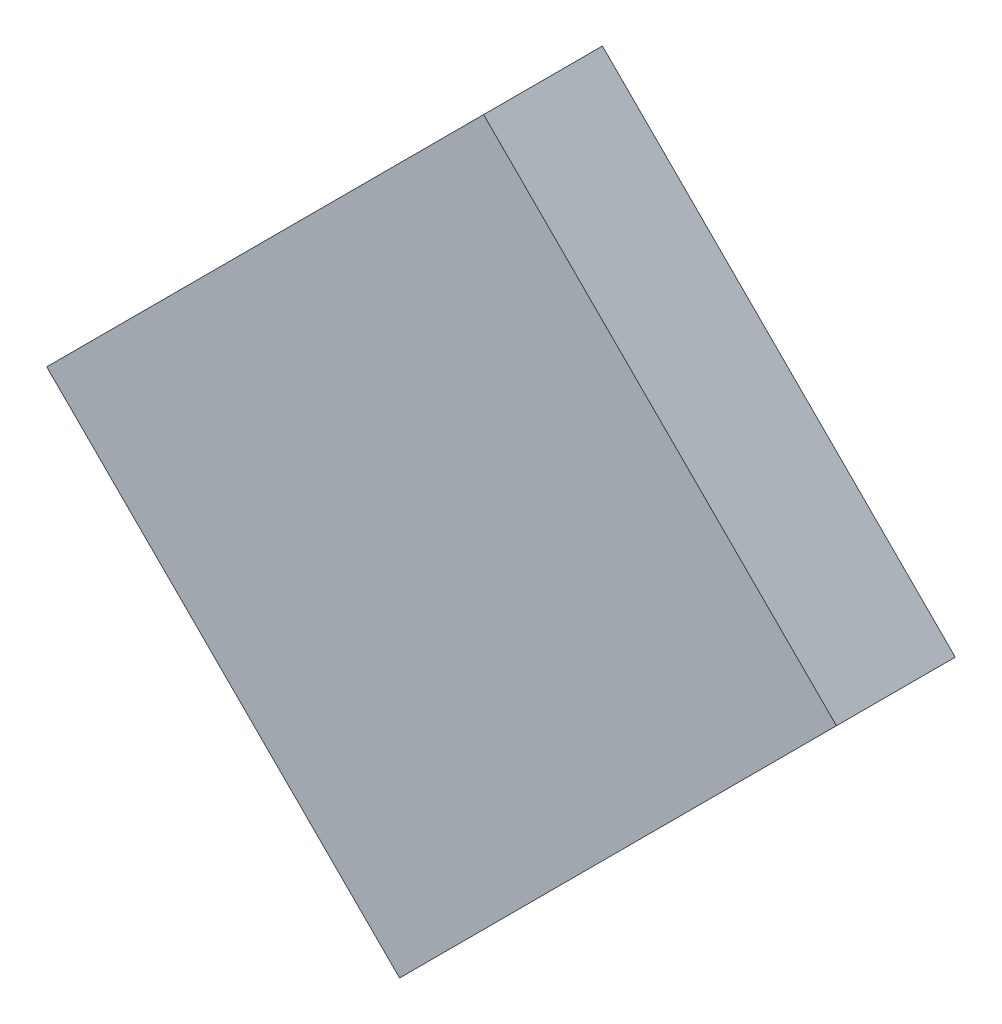
ISO-10303-21;
HEADER;
FILE_DESCRIPTION(('STEP AP214'),'2;1');
FILE_NAME('part.step','',(''),(''),'','','');
FILE_SCHEMA(('AUTOMOTIVE_DESIGN { 1 0 10303 214 1 1 1 1 }'));
ENDSEC;
DATA;
#1=APPLICATION_CONTEXT('core data for automotive mechanical design processes');
#2=APPLICATION_PROTOCOL_DEFINITION('international standard','automotive_design',2000,#1);
#3=PRODUCT_CONTEXT('',#1,'mechanical');
#4=PRODUCT('Part','Part','',(#3));
#5=PRODUCT_RELATED_PRODUCT_CATEGORY('part','',(#4));
#6=PRODUCT_DEFINITION_FORMATION('','',#4);
#7=PRODUCT_DEFINITION_CONTEXT('part definition',#1,'design');
#8=PRODUCT_DEFINITION('design','',#6,#7);
#9=PRODUCT_DEFINITION_SHAPE('','',#8);
#10=(LENGTH_UNIT() NAMED_UNIT(*) SI_UNIT(.MILLI.,.METRE.));
#11=(NAMED_UNIT(*) PLANE_ANGLE_UNIT() SI_UNIT($,.RADIAN.));
#12=(NAMED_UNIT(*) SI_UNIT($,.STERADIAN.) SOLID_ANGLE_UNIT());
#13=UNCERTAINTY_MEASURE_WITH_UNIT(LENGTH_MEASURE(1.E-05),#10,'distance_accuracy_value','');
#14=(GEOMETRIC_REPRESENTATION_CONTEXT(3) GLOBAL_UNCERTAINTY_ASSIGNED_CONTEXT((#13)) GLOBAL_UNIT_ASSIGNED_CONTEXT((#10,
#11,#12)) REPRESENTATION_CONTEXT('',''));
#15=CARTESIAN_POINT('',(0.,0.,0.));
#16=DIRECTION('',(0.,0.,1.));
#17=DIRECTION('',(1.,0.,0.));
#18=AXIS2_PLACEMENT_3D('',#15,#16,#17);
#19=CARTESIAN_POINT('',(0.17677892,1.66170102,0.499999));
#20=DIRECTION('',(0.,0.,1.));
#21=DIRECTION('',(1.,0.,0.));
#22=AXIS2_PLACEMENT_3D('',#19,#20,#21);
#23=PLANE('',#22);
#24=DIRECTION('',(0.707106781186548,0.707106781186548,0.));
#25=VECTOR('',#24,1.);
#26=CARTESIAN_POINT('',(1.66170102,0.17677892,0.499999));
#27=LINE('',#26,#25);
#28=CARTESIAN_POINT('',(1.66170102,0.17677892,0.499999));
#29=VERTEX_POINT('',#28);
#30=CARTESIAN_POINT('',(-0.17677638,-1.66169848,0.499999));
#31=VERTEX_POINT('',#30);
#32=EDGE_CURVE('E52',#29,#31,#27,.F.);
#33=ORIENTED_EDGE('',*,*,#32,.F.);
#34=DIRECTION('',(-0.707106781186548,0.707106781186548,0.));
#35=VECTOR('',#34,1.);
#36=CARTESIAN_POINT('',(0.17677892,1.66170102,0.499999));
#37=LINE('',#36,#35);
#38=CARTESIAN_POINT('',(0.17677892,1.66170102,0.499999));
#39=VERTEX_POINT('',#38);
#40=EDGE_CURVE('E67',#39,#29,#37,.F.);
#41=ORIENTED_EDGE('',*,*,#40,.F.);
#42=DIRECTION('',(-0.707106781186548,-0.707106781186548,0.));
#43=VECTOR('',#42,1.);
#44=CARTESIAN_POINT('',(-1.66169848,-0.17677638,0.499999));
#45=LINE('',#44,#43);
#46=CARTESIAN_POINT('',(-1.66169848,-0.17677638,0.499999));
#47=VERTEX_POINT('',#46);
#48=EDGE_CURVE('E19',#47,#39,#45,.F.);
#49=ORIENTED_EDGE('',*,*,#48,.F.);
#50=DIRECTION('',(0.707106781186548,-0.707106781186548,0.));
#51=VECTOR('',#50,1.);
#52=CARTESIAN_POINT('',(-0.17677638,-1.66169848,0.499999));
#53=LINE('',#52,#51);
#54=EDGE_CURVE('E57',#31,#47,#53,.F.);
#55=ORIENTED_EDGE('',*,*,#54,.F.);
#56=EDGE_LOOP('',(#33,#41,#49,#55));
#57=FACE_BOUND('',#56,.T.);
#58=ADVANCED_FACE('F16',(#57),#23,.T.);
#59=CARTESIAN_POINT('',(-1.66169848,-0.17677638,0.));
#60=DIRECTION('',(-0.707106781186548,0.707106781186548,0.));
#61=DIRECTION('',(-0.707106781186548,-0.707106781186548,0.));
#62=AXIS2_PLACEMENT_3D('',#59,#60,#61);
#63=PLANE('',#62);
#64=DIRECTION('',(0.,0.,1.));
#65=VECTOR('',#64,1.);
#66=CARTESIAN_POINT('',(0.17677892,1.66170102,0.));
#67=LINE('',#66,#65);
#68=CARTESIAN_POINT('',(0.17677892,1.66170102,0.));
#69=VERTEX_POINT('',#68);
#70=EDGE_CURVE('E78',#69,#39,#67,.T.);
#71=ORIENTED_EDGE('',*,*,#70,.F.);
#72=DIRECTION('',(-0.707106781186548,-0.707106781186547,0.));
#73=VECTOR('',#72,1.);
#74=CARTESIAN_POINT('',(0.17677892,1.66170102,0.));
#75=LINE('',#74,#73);
#76=CARTESIAN_POINT('',(-1.66169848,-0.17677638,0.));
#77=VERTEX_POINT('',#76);
#78=EDGE_CURVE('E73',#69,#77,#75,.T.);
#79=ORIENTED_EDGE('',*,*,#78,.T.);
#80=DIRECTION('',(0.,0.,1.));
#81=VECTOR('',#80,1.);
#82=CARTESIAN_POINT('',(-1.66169848,-0.17677638,0.));
#83=LINE('',#82,#81);
#84=EDGE_CURVE('E62',#47,#77,#83,.F.);
#85=ORIENTED_EDGE('',*,*,#84,.F.);
#86=ORIENTED_EDGE('',*,*,#48,.T.);
#87=EDGE_LOOP('',(#71,#79,#85,#86));
#88=FACE_BOUND('',#87,.T.);
#89=ADVANCED_FACE('F72',(#88),#63,.T.);
#90=CARTESIAN_POINT('',(-0.17677638,-1.66169848,0.));
#91=DIRECTION('',(-0.707106781186548,-0.707106781186548,0.));
#92=DIRECTION('',(0.707106781186548,-0.707106781186548,0.));
#93=AXIS2_PLACEMENT_3D('',#90,#91,#92);
#94=PLANE('',#93);
#95=ORIENTED_EDGE('',*,*,#84,.T.);
#96=DIRECTION('',(0.707106781186548,-0.707106781186548,0.));
#97=VECTOR('',#96,1.);
#98=CARTESIAN_POINT('',(-1.66169848,-0.17677638,0.));
#99=LINE('',#98,#97);
#100=CARTESIAN_POINT('',(-0.17677638,-1.66169848,0.));
#101=VERTEX_POINT('',#100);
#102=EDGE_CURVE('E83',#77,#101,#99,.T.);
#103=ORIENTED_EDGE('',*,*,#102,.T.);
#104=DIRECTION('',(0.,0.,1.));
#105=VECTOR('',#104,1.);
#106=CARTESIAN_POINT('',(-0.17677638,-1.66169848,0.));
#107=LINE('',#106,#105);
#108=EDGE_CURVE('E64',#31,#101,#107,.F.);
#109=ORIENTED_EDGE('',*,*,#108,.F.);
#110=ORIENTED_EDGE('',*,*,#54,.T.);
#111=EDGE_LOOP('',(#95,#103,#109,#110));
#112=FACE_BOUND('',#111,.T.);
#113=ADVANCED_FACE('F59',(#112),#94,.T.);
#114=CARTESIAN_POINT('',(1.66170102,0.17677892,0.));
#115=DIRECTION('',(0.707106781186548,-0.707106781186548,0.));
#116=DIRECTION('',(0.707106781186548,0.707106781186548,0.));
#117=AXIS2_PLACEMENT_3D('',#114,#115,#116);
#118=PLANE('',#117);
#119=ORIENTED_EDGE('',*,*,#108,.T.);
#120=DIRECTION('',(0.707106781186547,0.707106781186548,0.));
#121=VECTOR('',#120,1.);
#122=CARTESIAN_POINT('',(-0.17677638,-1.66169848,0.));
#123=LINE('',#122,#121);
#124=CARTESIAN_POINT('',(1.66170102,0.17677892,0.));
#125=VERTEX_POINT('',#124);
#126=EDGE_CURVE('E25',#101,#125,#123,.T.);
#127=ORIENTED_EDGE('',*,*,#126,.T.);
#128=DIRECTION('',(0.,0.,1.));
#129=VECTOR('',#128,1.);
#130=CARTESIAN_POINT('',(1.66170102,0.17677892,0.));
#131=LINE('',#130,#129);
#132=EDGE_CURVE('E33',#29,#125,#131,.F.);
#133=ORIENTED_EDGE('',*,*,#132,.F.);
#134=ORIENTED_EDGE('',*,*,#32,.T.);
#135=EDGE_LOOP('',(#119,#127,#133,#134));
#136=FACE_BOUND('',#135,.T.);
#137=ADVANCED_FACE('F87',(#136),#118,.T.);
#138=CARTESIAN_POINT('',(0.17677892,1.66170102,0.));
#139=DIRECTION('',(0.707106781186548,0.707106781186548,0.));
#140=DIRECTION('',(-0.707106781186548,0.707106781186548,0.));
#141=AXIS2_PLACEMENT_3D('',#138,#139,#140);
#142=PLANE('',#141);
#143=ORIENTED_EDGE('',*,*,#132,.T.);
#144=DIRECTION('',(-0.707106781186547,0.707106781186547,0.));
#145=VECTOR('',#144,1.);
#146=CARTESIAN_POINT('',(1.66170102,0.17677892,0.));
#147=LINE('',#146,#145);
#148=EDGE_CURVE('E11',#125,#69,#147,.T.);
#149=ORIENTED_EDGE('',*,*,#148,.T.);
#150=ORIENTED_EDGE('',*,*,#70,.T.);
#151=ORIENTED_EDGE('',*,*,#40,.T.);
#152=EDGE_LOOP('',(#143,#149,#150,#151));
#153=FACE_BOUND('',#152,.T.);
#154=ADVANCED_FACE('F90',(#153),#142,.T.);
#155=CARTESIAN_POINT('',(0.17677892,1.66170102,0.));
#156=DIRECTION('',(0.,0.,1.));
#157=DIRECTION('',(1.,0.,0.));
#158=AXIS2_PLACEMENT_3D('',#155,#156,#157);
#159=PLANE('',#158);
#160=ORIENTED_EDGE('',*,*,#126,.F.);
#161=ORIENTED_EDGE('',*,*,#102,.F.);
#162=ORIENTED_EDGE('',*,*,#78,.F.);
#163=ORIENTED_EDGE('',*,*,#148,.F.);
#164=EDGE_LOOP('',(#160,#161,#162,#163));
#165=FACE_BOUND('',#164,.T.);
#166=ADVANCED_FACE('F89',(#165),#159,.F.);
#167=CLOSED_SHELL('',(#58,#89,#113,#137,#154,#166));
#168=MANIFOLD_SOLID_BREP('B1',#167);
#169=ADVANCED_BREP_SHAPE_REPRESENTATION('',(#18,#168),#14);
#170=SHAPE_DEFINITION_REPRESENTATION(#9,#169);
ENDSEC;
END-ISO-10303-21;
